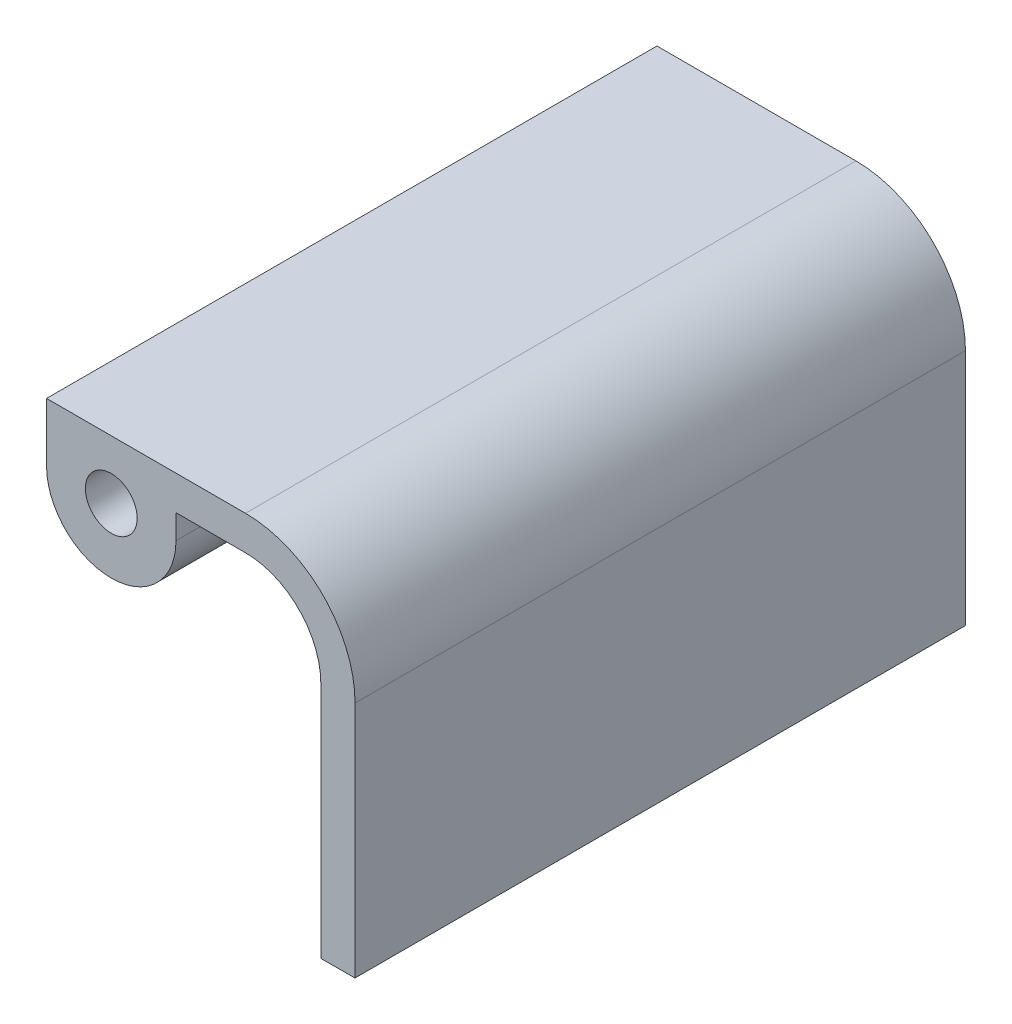
ISO-10303-21;
HEADER;
FILE_DESCRIPTION(('STEP AP214'),'2;1');
FILE_NAME('part.step','',(''),(''),'','','');
FILE_SCHEMA(('AUTOMOTIVE_DESIGN { 1 0 10303 214 1 1 1 1 }'));
ENDSEC;
DATA;
#1=APPLICATION_CONTEXT('core data for automotive mechanical design processes');
#2=APPLICATION_PROTOCOL_DEFINITION('international standard','automotive_design',2000,#1);
#3=PRODUCT_CONTEXT('',#1,'mechanical');
#4=PRODUCT('Part','Part','',(#3));
#5=PRODUCT_RELATED_PRODUCT_CATEGORY('part','',(#4));
#6=PRODUCT_DEFINITION_FORMATION('','',#4);
#7=PRODUCT_DEFINITION_CONTEXT('part definition',#1,'design');
#8=PRODUCT_DEFINITION('design','',#6,#7);
#9=PRODUCT_DEFINITION_SHAPE('','',#8);
#10=(LENGTH_UNIT() NAMED_UNIT(*) SI_UNIT(.MILLI.,.METRE.));
#11=(NAMED_UNIT(*) PLANE_ANGLE_UNIT() SI_UNIT($,.RADIAN.));
#12=(NAMED_UNIT(*) SI_UNIT($,.STERADIAN.) SOLID_ANGLE_UNIT());
#13=UNCERTAINTY_MEASURE_WITH_UNIT(LENGTH_MEASURE(1.E-05),#10,'distance_accuracy_value','');
#14=(GEOMETRIC_REPRESENTATION_CONTEXT(3) GLOBAL_UNCERTAINTY_ASSIGNED_CONTEXT((#13)) GLOBAL_UNIT_ASSIGNED_CONTEXT((#10,
#11,#12)) REPRESENTATION_CONTEXT('',''));
#15=CARTESIAN_POINT('',(0.,0.,0.));
#16=DIRECTION('',(0.,0.,1.));
#17=DIRECTION('',(1.,0.,0.));
#18=AXIS2_PLACEMENT_3D('',#15,#16,#17);
#19=CARTESIAN_POINT('',(-86.3331910632718,204.196458107681,56.59882));
#20=DIRECTION('',(0.,0.,1.));
#21=DIRECTION('',(1.,0.,0.));
#22=AXIS2_PLACEMENT_3D('',#19,#20,#21);
#23=PLANE('',#22);
#24=DIRECTION('',(0.,1.,0.));
#25=VECTOR('',#24,1.);
#26=CARTESIAN_POINT('',(-76.1731910632717,182.11715682314,56.59882));
#27=LINE('',#26,#25);
#28=CARTESIAN_POINT('',(-76.1731910632717,182.11715682314,56.59882));
#29=VERTEX_POINT('',#28);
#30=CARTESIAN_POINT('',(-76.1731910632717,204.196458107681,56.59882));
#31=VERTEX_POINT('',#30);
#32=EDGE_CURVE('E165',#29,#31,#27,.T.);
#33=ORIENTED_EDGE('',*,*,#32,.T.);
#34=CARTESIAN_POINT('',(-86.3331910632718,204.196458107681,56.59882));
#35=DIRECTION('',(0.,0.,1.));
#36=DIRECTION('',(1.,0.,0.));
#37=AXIS2_PLACEMENT_3D('',#34,#35,#36);
#38=CIRCLE('',#37,10.16);
#39=CARTESIAN_POINT('',(-86.3331910632718,214.356458107681,56.59882));
#40=VERTEX_POINT('',#39);
#41=EDGE_CURVE('E102',#31,#40,#38,.T.);
#42=ORIENTED_EDGE('',*,*,#41,.T.);
#43=DIRECTION('',(-1.,0.,0.));
#44=VECTOR('',#43,1.);
#45=CARTESIAN_POINT('',(-86.3331910632718,214.356458107681,56.59882));
#46=LINE('',#45,#44);
#47=CARTESIAN_POINT('',(-104.778191065273,214.356458107681,56.59882));
#48=VERTEX_POINT('',#47);
#49=EDGE_CURVE('E185',#40,#48,#46,.T.);
#50=ORIENTED_EDGE('',*,*,#49,.T.);
#51=DIRECTION('',(0.,-1.,0.));
#52=VECTOR('',#51,1.);
#53=CARTESIAN_POINT('',(-104.778191065273,214.356458107681,56.59882));
#54=LINE('',#53,#52);
#55=CARTESIAN_POINT('',(-104.778191065273,208.926458107681,56.59882));
#56=VERTEX_POINT('',#55);
#57=EDGE_CURVE('E206',#48,#56,#54,.T.);
#58=ORIENTED_EDGE('',*,*,#57,.T.);
#59=CARTESIAN_POINT('',(-98.7781910652728,208.926458107681,56.59882));
#60=DIRECTION('',(0.,0.,1.));
#61=DIRECTION('',(-1.,0.,0.));
#62=AXIS2_PLACEMENT_3D('',#59,#60,#61);
#63=CIRCLE('',#62,6.);
#64=CARTESIAN_POINT('',(-92.7781910652727,208.926458107681,56.59882));
#65=VERTEX_POINT('',#64);
#66=EDGE_CURVE('E203',#56,#65,#63,.T.);
#67=ORIENTED_EDGE('',*,*,#66,.T.);
#68=DIRECTION('',(0.,1.,0.));
#69=VECTOR('',#68,1.);
#70=CARTESIAN_POINT('',(-92.7781910652727,211.181458107681,56.59882));
#71=LINE('',#70,#69);
#72=CARTESIAN_POINT('',(-92.7781910652727,211.181458107681,56.59882));
#73=VERTEX_POINT('',#72);
#74=EDGE_CURVE('E205',#65,#73,#71,.T.);
#75=ORIENTED_EDGE('',*,*,#74,.T.);
#76=DIRECTION('',(1.,0.,0.));
#77=VECTOR('',#76,1.);
#78=CARTESIAN_POINT('',(-86.3331910632718,211.181458107681,56.59882));
#79=LINE('',#78,#77);
#80=CARTESIAN_POINT('',(-86.3331910632718,211.181458107681,56.59882));
#81=VERTEX_POINT('',#80);
#82=EDGE_CURVE('E127',#73,#81,#79,.T.);
#83=ORIENTED_EDGE('',*,*,#82,.T.);
#84=CARTESIAN_POINT('',(-86.3331910632718,204.196458107681,56.59882));
#85=DIRECTION('',(0.,0.,-1.));
#86=DIRECTION('',(1.,0.,0.));
#87=AXIS2_PLACEMENT_3D('',#84,#85,#86);
#88=CIRCLE('',#87,6.985);
#89=CARTESIAN_POINT('',(-79.3481910632717,204.196458107681,56.59882));
#90=VERTEX_POINT('',#89);
#91=EDGE_CURVE('E121',#81,#90,#88,.T.);
#92=ORIENTED_EDGE('',*,*,#91,.T.);
#93=DIRECTION('',(0.,-1.,0.));
#94=VECTOR('',#93,1.);
#95=CARTESIAN_POINT('',(-79.3481910632716,182.096951811253,56.59882));
#96=LINE('',#95,#94);
#97=CARTESIAN_POINT('',(-79.3481910632716,182.096951811253,56.59882));
#98=VERTEX_POINT('',#97);
#99=EDGE_CURVE('E125',#90,#98,#96,.T.);
#100=ORIENTED_EDGE('',*,*,#99,.T.);
#101=DIRECTION('',(0.999979751746242,0.00636365441581863,0.));
#102=VECTOR('',#101,1.);
#103=CARTESIAN_POINT('',(-76.1731910632717,182.11715682314,56.59882));
#104=LINE('',#103,#102);
#105=EDGE_CURVE('E53',#98,#29,#104,.T.);
#106=ORIENTED_EDGE('',*,*,#105,.T.);
#107=EDGE_LOOP('',(#33,#42,#50,#58,#67,#75,#83,#92,#100,#106));
#108=FACE_BOUND('',#107,.T.);
#109=CARTESIAN_POINT('',(-98.7781910652728,208.926458107681,56.59882));
#110=DIRECTION('',(0.,0.,1.));
#111=DIRECTION('',(1.,0.,0.));
#112=AXIS2_PLACEMENT_3D('',#109,#110,#111);
#113=CIRCLE('',#112,2.40000000000135);
#114=CARTESIAN_POINT('',(-96.3781910652714,208.926458107681,56.59882));
#115=VERTEX_POINT('',#114);
#116=EDGE_CURVE('E149',#115,#115,#113,.T.);
#117=ORIENTED_EDGE('',*,*,#116,.F.);
#118=EDGE_LOOP('',(#117));
#119=FACE_BOUND('',#118,.T.);
#120=ADVANCED_FACE('F36',(#108,#119),#23,.T.);
#121=CARTESIAN_POINT('',(-86.3331910632718,204.196458107681,0.));
#122=DIRECTION('',(0.,0.,1.));
#123=DIRECTION('',(1.,0.,0.));
#124=AXIS2_PLACEMENT_3D('',#121,#122,#123);
#125=PLANE('',#124);
#126=DIRECTION('',(0.,1.,0.));
#127=VECTOR('',#126,1.);
#128=CARTESIAN_POINT('',(-76.1731910632717,182.11715682314,0.));
#129=LINE('',#128,#127);
#130=CARTESIAN_POINT('',(-76.1731910632717,182.11715682314,0.));
#131=VERTEX_POINT('',#130);
#132=CARTESIAN_POINT('',(-76.1731910632717,204.196458107681,0.));
#133=VERTEX_POINT('',#132);
#134=EDGE_CURVE('E145',#131,#133,#129,.T.);
#135=ORIENTED_EDGE('',*,*,#134,.F.);
#136=DIRECTION('',(0.999979751746242,0.00636365441581863,0.));
#137=VECTOR('',#136,1.);
#138=CARTESIAN_POINT('',(-76.1731910632717,182.11715682314,0.));
#139=LINE('',#138,#137);
#140=CARTESIAN_POINT('',(-79.3481910632716,182.096951811253,0.));
#141=VERTEX_POINT('',#140);
#142=EDGE_CURVE('E94',#141,#131,#139,.T.);
#143=ORIENTED_EDGE('',*,*,#142,.F.);
#144=DIRECTION('',(0.,-1.,0.));
#145=VECTOR('',#144,1.);
#146=CARTESIAN_POINT('',(-79.3481910632716,182.096951811253,0.));
#147=LINE('',#146,#145);
#148=CARTESIAN_POINT('',(-79.3481910632717,204.196458107681,0.));
#149=VERTEX_POINT('',#148);
#150=EDGE_CURVE('E88',#149,#141,#147,.T.);
#151=ORIENTED_EDGE('',*,*,#150,.F.);
#152=CARTESIAN_POINT('',(-86.3331910632718,204.196458107681,0.));
#153=DIRECTION('',(0.,0.,-1.));
#154=DIRECTION('',(1.,0.,0.));
#155=AXIS2_PLACEMENT_3D('',#152,#153,#154);
#156=CIRCLE('',#155,6.985);
#157=CARTESIAN_POINT('',(-86.3331910632718,211.181458107681,0.));
#158=VERTEX_POINT('',#157);
#159=EDGE_CURVE('E135',#158,#149,#156,.T.);
#160=ORIENTED_EDGE('',*,*,#159,.F.);
#161=DIRECTION('',(1.,0.,0.));
#162=VECTOR('',#161,1.);
#163=CARTESIAN_POINT('',(-86.3331910632718,211.181458107681,0.));
#164=LINE('',#163,#162);
#165=CARTESIAN_POINT('',(-92.7781910652727,211.181458107681,0.));
#166=VERTEX_POINT('',#165);
#167=EDGE_CURVE('E160',#166,#158,#164,.T.);
#168=ORIENTED_EDGE('',*,*,#167,.F.);
#169=DIRECTION('',(0.,1.,0.));
#170=VECTOR('',#169,1.);
#171=CARTESIAN_POINT('',(-92.7781910652727,211.181458107681,0.));
#172=LINE('',#171,#170);
#173=CARTESIAN_POINT('',(-92.7781910652727,208.926458107681,0.));
#174=VERTEX_POINT('',#173);
#175=EDGE_CURVE('E158',#174,#166,#172,.T.);
#176=ORIENTED_EDGE('',*,*,#175,.F.);
#177=CARTESIAN_POINT('',(-98.7781910652728,208.926458107681,0.));
#178=DIRECTION('',(0.,0.,1.));
#179=DIRECTION('',(-1.,0.,0.));
#180=AXIS2_PLACEMENT_3D('',#177,#178,#179);
#181=CIRCLE('',#180,6.);
#182=CARTESIAN_POINT('',(-104.778191065273,208.926458107681,0.));
#183=VERTEX_POINT('',#182);
#184=EDGE_CURVE('E156',#183,#174,#181,.T.);
#185=ORIENTED_EDGE('',*,*,#184,.F.);
#186=DIRECTION('',(0.,-1.,0.));
#187=VECTOR('',#186,1.);
#188=CARTESIAN_POINT('',(-104.778191065273,214.356458107681,0.));
#189=LINE('',#188,#187);
#190=CARTESIAN_POINT('',(-104.778191065273,214.356458107681,0.));
#191=VERTEX_POINT('',#190);
#192=EDGE_CURVE('E154',#191,#183,#189,.T.);
#193=ORIENTED_EDGE('',*,*,#192,.F.);
#194=DIRECTION('',(-1.,0.,0.));
#195=VECTOR('',#194,1.);
#196=CARTESIAN_POINT('',(-104.778191065273,214.356458107681,0.));
#197=LINE('',#196,#195);
#198=CARTESIAN_POINT('',(-86.3331910632718,214.356458107681,0.));
#199=VERTEX_POINT('',#198);
#200=EDGE_CURVE('E152',#199,#191,#197,.T.);
#201=ORIENTED_EDGE('',*,*,#200,.F.);
#202=CARTESIAN_POINT('',(-86.3331910632718,204.196458107681,0.));
#203=DIRECTION('',(0.,0.,1.));
#204=DIRECTION('',(1.,0.,0.));
#205=AXIS2_PLACEMENT_3D('',#202,#203,#204);
#206=CIRCLE('',#205,10.16);
#207=EDGE_CURVE('E148',#133,#199,#206,.T.);
#208=ORIENTED_EDGE('',*,*,#207,.F.);
#209=EDGE_LOOP('',(#135,#143,#151,#160,#168,#176,#185,#193,#201,#208));
#210=FACE_BOUND('',#209,.T.);
#211=CARTESIAN_POINT('',(-98.7781910652728,208.926458107681,0.));
#212=DIRECTION('',(0.,0.,1.));
#213=DIRECTION('',(1.,0.,0.));
#214=AXIS2_PLACEMENT_3D('',#211,#212,#213);
#215=CIRCLE('',#214,2.40000000000135);
#216=CARTESIAN_POINT('',(-96.3781910652714,208.926458107681,0.));
#217=VERTEX_POINT('',#216);
#218=EDGE_CURVE('E214',#217,#217,#215,.T.);
#219=ORIENTED_EDGE('',*,*,#218,.T.);
#220=EDGE_LOOP('',(#219));
#221=FACE_BOUND('',#220,.T.);
#222=ADVANCED_FACE('F190',(#210,#221),#125,.F.);
#223=CARTESIAN_POINT('',(-76.1731910632717,182.11715682314,56.59882));
#224=DIRECTION('',(-1.,0.,0.));
#225=DIRECTION('',(0.,-1.,0.));
#226=AXIS2_PLACEMENT_3D('',#223,#224,#225);
#227=PLANE('',#226);
#228=ORIENTED_EDGE('',*,*,#134,.T.);
#229=DIRECTION('',(0.,0.,-1.));
#230=VECTOR('',#229,1.);
#231=CARTESIAN_POINT('',(-76.1731910632717,204.196458107681,56.59882));
#232=LINE('',#231,#230);
#233=EDGE_CURVE('E11',#31,#133,#232,.T.);
#234=ORIENTED_EDGE('',*,*,#233,.F.);
#235=ORIENTED_EDGE('',*,*,#32,.F.);
#236=DIRECTION('',(0.,0.,-1.));
#237=VECTOR('',#236,1.);
#238=CARTESIAN_POINT('',(-76.1731910632717,182.11715682314,56.59882));
#239=LINE('',#238,#237);
#240=EDGE_CURVE('E141',#29,#131,#239,.T.);
#241=ORIENTED_EDGE('',*,*,#240,.T.);
#242=EDGE_LOOP('',(#228,#234,#235,#241));
#243=FACE_BOUND('',#242,.T.);
#244=ADVANCED_FACE('F38',(#243),#227,.F.);
#245=CARTESIAN_POINT('',(-86.3331910632718,204.196458107681,56.59882));
#246=DIRECTION('',(0.,0.,-1.));
#247=DIRECTION('',(-1.,0.,0.));
#248=AXIS2_PLACEMENT_3D('',#245,#246,#247);
#249=CYLINDRICAL_SURFACE('',#248,10.16);
#250=ORIENTED_EDGE('',*,*,#207,.T.);
#251=DIRECTION('',(0.,0.,-1.));
#252=VECTOR('',#251,1.);
#253=CARTESIAN_POINT('',(-86.3331910632718,214.356458107681,56.59882));
#254=LINE('',#253,#252);
#255=EDGE_CURVE('E45',#40,#199,#254,.T.);
#256=ORIENTED_EDGE('',*,*,#255,.F.);
#257=ORIENTED_EDGE('',*,*,#41,.F.);
#258=ORIENTED_EDGE('',*,*,#233,.T.);
#259=EDGE_LOOP('',(#250,#256,#257,#258));
#260=FACE_BOUND('',#259,.T.);
#261=ADVANCED_FACE('F186',(#260),#249,.T.);
#262=CARTESIAN_POINT('',(-104.778191065273,214.356458107681,56.59882));
#263=DIRECTION('',(0.,-1.,0.));
#264=DIRECTION('',(0.,0.,-1.));
#265=AXIS2_PLACEMENT_3D('',#262,#263,#264);
#266=PLANE('',#265);
#267=ORIENTED_EDGE('',*,*,#200,.T.);
#268=DIRECTION('',(0.,0.,-1.));
#269=VECTOR('',#268,1.);
#270=CARTESIAN_POINT('',(-104.778191065273,214.356458107681,56.59882));
#271=LINE('',#270,#269);
#272=EDGE_CURVE('E178',#48,#191,#271,.T.);
#273=ORIENTED_EDGE('',*,*,#272,.F.);
#274=ORIENTED_EDGE('',*,*,#49,.F.);
#275=ORIENTED_EDGE('',*,*,#255,.T.);
#276=EDGE_LOOP('',(#267,#273,#274,#275));
#277=FACE_BOUND('',#276,.T.);
#278=ADVANCED_FACE('F183',(#277),#266,.F.);
#279=CARTESIAN_POINT('',(-104.778191065273,214.356458107681,56.59882));
#280=DIRECTION('',(1.,0.,0.));
#281=DIRECTION('',(0.,0.,-1.));
#282=AXIS2_PLACEMENT_3D('',#279,#280,#281);
#283=PLANE('',#282);
#284=ORIENTED_EDGE('',*,*,#192,.T.);
#285=DIRECTION('',(0.,0.,-1.));
#286=VECTOR('',#285,1.);
#287=CARTESIAN_POINT('',(-104.778191065273,208.926458107681,56.59882));
#288=LINE('',#287,#286);
#289=EDGE_CURVE('E175',#56,#183,#288,.T.);
#290=ORIENTED_EDGE('',*,*,#289,.F.);
#291=ORIENTED_EDGE('',*,*,#57,.F.);
#292=ORIENTED_EDGE('',*,*,#272,.T.);
#293=EDGE_LOOP('',(#284,#290,#291,#292));
#294=FACE_BOUND('',#293,.T.);
#295=ADVANCED_FACE('F197',(#294),#283,.F.);
#296=CARTESIAN_POINT('',(-98.7781910652728,208.926458107681,56.59882));
#297=DIRECTION('',(0.,0.,-1.));
#298=DIRECTION('',(-1.,0.,0.));
#299=AXIS2_PLACEMENT_3D('',#296,#297,#298);
#300=CYLINDRICAL_SURFACE('',#299,6.);
#301=ORIENTED_EDGE('',*,*,#184,.T.);
#302=DIRECTION('',(0.,0.,-1.));
#303=VECTOR('',#302,1.);
#304=CARTESIAN_POINT('',(-92.7781910652727,208.926458107681,56.59882));
#305=LINE('',#304,#303);
#306=EDGE_CURVE('E172',#65,#174,#305,.T.);
#307=ORIENTED_EDGE('',*,*,#306,.F.);
#308=ORIENTED_EDGE('',*,*,#66,.F.);
#309=ORIENTED_EDGE('',*,*,#289,.T.);
#310=EDGE_LOOP('',(#301,#307,#308,#309));
#311=FACE_BOUND('',#310,.T.);
#312=ADVANCED_FACE('F201',(#311),#300,.T.);
#313=CARTESIAN_POINT('',(-92.7781910652727,211.181458107681,56.59882));
#314=DIRECTION('',(-1.,0.,0.));
#315=DIRECTION('',(0.,0.,1.));
#316=AXIS2_PLACEMENT_3D('',#313,#314,#315);
#317=PLANE('',#316);
#318=ORIENTED_EDGE('',*,*,#175,.T.);
#319=DIRECTION('',(0.,0.,-1.));
#320=VECTOR('',#319,1.);
#321=CARTESIAN_POINT('',(-92.7781910652727,211.181458107681,56.59882));
#322=LINE('',#321,#320);
#323=EDGE_CURVE('E169',#73,#166,#322,.T.);
#324=ORIENTED_EDGE('',*,*,#323,.F.);
#325=ORIENTED_EDGE('',*,*,#74,.F.);
#326=ORIENTED_EDGE('',*,*,#306,.T.);
#327=EDGE_LOOP('',(#318,#324,#325,#326));
#328=FACE_BOUND('',#327,.T.);
#329=ADVANCED_FACE('F240',(#328),#317,.F.);
#330=CARTESIAN_POINT('',(-86.3331910632718,211.181458107681,56.59882));
#331=DIRECTION('',(0.,1.,0.));
#332=DIRECTION('',(0.,0.,1.));
#333=AXIS2_PLACEMENT_3D('',#330,#331,#332);
#334=PLANE('',#333);
#335=ORIENTED_EDGE('',*,*,#167,.T.);
#336=DIRECTION('',(0.,0.,-1.));
#337=VECTOR('',#336,1.);
#338=CARTESIAN_POINT('',(-86.3331910632718,211.181458107681,56.59882));
#339=LINE('',#338,#337);
#340=EDGE_CURVE('E136',#81,#158,#339,.T.);
#341=ORIENTED_EDGE('',*,*,#340,.F.);
#342=ORIENTED_EDGE('',*,*,#82,.F.);
#343=ORIENTED_EDGE('',*,*,#323,.T.);
#344=EDGE_LOOP('',(#335,#341,#342,#343));
#345=FACE_BOUND('',#344,.T.);
#346=ADVANCED_FACE('F237',(#345),#334,.F.);
#347=CARTESIAN_POINT('',(-86.3331910632718,204.196458107681,56.59882));
#348=DIRECTION('',(0.,0.,-1.));
#349=DIRECTION('',(-1.,0.,0.));
#350=AXIS2_PLACEMENT_3D('',#347,#348,#349);
#351=CYLINDRICAL_SURFACE('',#350,6.985);
#352=ORIENTED_EDGE('',*,*,#159,.T.);
#353=DIRECTION('',(0.,0.,-1.));
#354=VECTOR('',#353,1.);
#355=CARTESIAN_POINT('',(-79.3481910632717,204.196458107681,56.59882));
#356=LINE('',#355,#354);
#357=EDGE_CURVE('E132',#90,#149,#356,.T.);
#358=ORIENTED_EDGE('',*,*,#357,.F.);
#359=ORIENTED_EDGE('',*,*,#91,.F.);
#360=ORIENTED_EDGE('',*,*,#340,.T.);
#361=EDGE_LOOP('',(#352,#358,#359,#360));
#362=FACE_BOUND('',#361,.T.);
#363=ADVANCED_FACE('F133',(#362),#351,.F.);
#364=CARTESIAN_POINT('',(-79.3481910632716,182.096951811253,56.59882));
#365=DIRECTION('',(1.,0.,0.));
#366=DIRECTION('',(0.,1.,0.));
#367=AXIS2_PLACEMENT_3D('',#364,#365,#366);
#368=PLANE('',#367);
#369=ORIENTED_EDGE('',*,*,#150,.T.);
#370=DIRECTION('',(0.,0.,-1.));
#371=VECTOR('',#370,1.);
#372=CARTESIAN_POINT('',(-79.3481910632716,182.096951811253,56.59882));
#373=LINE('',#372,#371);
#374=EDGE_CURVE('E137',#98,#141,#373,.T.);
#375=ORIENTED_EDGE('',*,*,#374,.F.);
#376=ORIENTED_EDGE('',*,*,#99,.F.);
#377=ORIENTED_EDGE('',*,*,#357,.T.);
#378=EDGE_LOOP('',(#369,#375,#376,#377));
#379=FACE_BOUND('',#378,.T.);
#380=ADVANCED_FACE('F139',(#379),#368,.F.);
#381=CARTESIAN_POINT('',(-76.1731910632717,182.11715682314,56.59882));
#382=DIRECTION('',(-0.00636365441581863,0.999979751746242,0.));
#383=DIRECTION('',(-0.999979751746242,-0.00636365441581863,0.));
#384=AXIS2_PLACEMENT_3D('',#381,#382,#383);
#385=PLANE('',#384);
#386=ORIENTED_EDGE('',*,*,#142,.T.);
#387=ORIENTED_EDGE('',*,*,#240,.F.);
#388=ORIENTED_EDGE('',*,*,#105,.F.);
#389=ORIENTED_EDGE('',*,*,#374,.T.);
#390=EDGE_LOOP('',(#386,#387,#388,#389));
#391=FACE_BOUND('',#390,.T.);
#392=ADVANCED_FACE('F230',(#391),#385,.F.);
#393=CARTESIAN_POINT('',(-98.7781910652728,208.926458107681,56.59882));
#394=DIRECTION('',(0.,0.,-1.));
#395=DIRECTION('',(-1.,0.,0.));
#396=AXIS2_PLACEMENT_3D('',#393,#394,#395);
#397=CYLINDRICAL_SURFACE('',#396,2.40000000000135);
#398=ORIENTED_EDGE('',*,*,#116,.T.);
#399=EDGE_LOOP('',(#398));
#400=FACE_BOUND('',#399,.T.);
#401=ORIENTED_EDGE('',*,*,#218,.F.);
#402=EDGE_LOOP('',(#401));
#403=FACE_BOUND('',#402,.T.);
#404=ADVANCED_FACE('F220',(#400,#403),#397,.F.);
#405=CLOSED_SHELL('',(#120,#222,#244,#261,#278,#295,#312,#329,#346,#363,#380,#392,#404));
#406=MANIFOLD_SOLID_BREP('B2',#405);
#407=ADVANCED_BREP_SHAPE_REPRESENTATION('',(#18,#406),#14);
#408=SHAPE_DEFINITION_REPRESENTATION(#9,#407);
ENDSEC;
END-ISO-10303-21;
